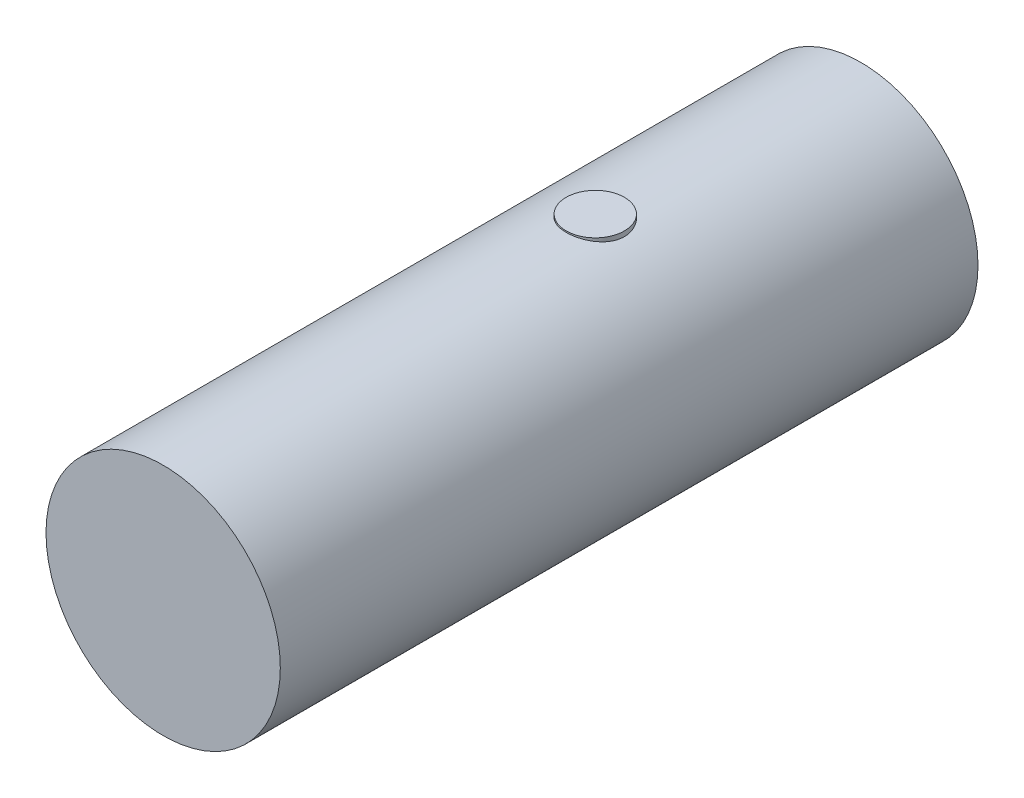
ISO-10303-21;
HEADER;
FILE_DESCRIPTION(('STEP AP214'),'2;1');
FILE_NAME('part.step','',(''),(''),'','','');
FILE_SCHEMA(('AUTOMOTIVE_DESIGN { 1 0 10303 214 1 1 1 1 }'));
ENDSEC;
DATA;
#1=APPLICATION_CONTEXT('core data for automotive mechanical design processes');
#2=APPLICATION_PROTOCOL_DEFINITION('international standard','automotive_design',2000,#1);
#3=PRODUCT_CONTEXT('',#1,'mechanical');
#4=PRODUCT('Part','Part','',(#3));
#5=PRODUCT_RELATED_PRODUCT_CATEGORY('part','',(#4));
#6=PRODUCT_DEFINITION_FORMATION('','',#4);
#7=PRODUCT_DEFINITION_CONTEXT('part definition',#1,'design');
#8=PRODUCT_DEFINITION('design','',#6,#7);
#9=PRODUCT_DEFINITION_SHAPE('','',#8);
#10=(LENGTH_UNIT() NAMED_UNIT(*) SI_UNIT(.MILLI.,.METRE.));
#11=(NAMED_UNIT(*) PLANE_ANGLE_UNIT() SI_UNIT($,.RADIAN.));
#12=(NAMED_UNIT(*) SI_UNIT($,.STERADIAN.) SOLID_ANGLE_UNIT());
#13=UNCERTAINTY_MEASURE_WITH_UNIT(LENGTH_MEASURE(1.E-05),#10,'distance_accuracy_value','');
#14=(GEOMETRIC_REPRESENTATION_CONTEXT(3) GLOBAL_UNCERTAINTY_ASSIGNED_CONTEXT((#13)) GLOBAL_UNIT_ASSIGNED_CONTEXT((#10,
#11,#12)) REPRESENTATION_CONTEXT('',''));
#15=CARTESIAN_POINT('',(0.,0.,0.));
#16=DIRECTION('',(0.,0.,1.));
#17=DIRECTION('',(1.,0.,0.));
#18=AXIS2_PLACEMENT_3D('',#15,#16,#17);
#19=CARTESIAN_POINT('',(0.,0.,530.));
#20=DIRECTION('',(0.,0.,-1.));
#21=DIRECTION('',(-1.,0.,0.));
#22=AXIS2_PLACEMENT_3D('',#19,#20,#21);
#23=CYLINDRICAL_SURFACE('',#22,89.);
#24=CARTESIAN_POINT('',(0.,-89.,223.836722891361));
#25=CARTESIAN_POINT('',(0.611417434861066,-88.9999985464395,223.836720283032));
#26=CARTESIAN_POINT('',(1.22288743460136,-88.9936837681099,223.811358850198));
#27=CARTESIAN_POINT('',(2.44141315504862,-88.9685956655376,223.71011842906));
#28=CARTESIAN_POINT('',(3.04846835638632,-88.9498208986903,223.634233591205));
#29=CARTESIAN_POINT('',(4.25405471726366,-88.9003215166107,223.432534381407));
#30=CARTESIAN_POINT('',(4.85258133373351,-88.869590762381,223.306694358479));
#31=CARTESIAN_POINT('',(6.03651638128261,-88.7970283616154,223.006130425489));
#32=CARTESIAN_POINT('',(6.62192515325348,-88.7551970039129,222.831407787328));
#33=CARTESIAN_POINT('',(7.77488875315294,-88.6616335104024,222.434716977997));
#34=CARTESIAN_POINT('',(8.34246429320108,-88.6099133950601,222.21280613098));
#35=CARTESIAN_POINT('',(9.45668604219611,-88.4979358023704,221.723315007667));
#36=CARTESIAN_POINT('',(10.0033321378508,-88.4376782788179,221.455734484203));
#37=CARTESIAN_POINT('',(11.0721153941217,-88.3102368754896,220.876868011026));
#38=CARTESIAN_POINT('',(11.5942525985915,-88.2430530081078,220.56558213952));
#39=CARTESIAN_POINT('',(12.6106869916732,-88.1035400960233,219.901485261214));
#40=CARTESIAN_POINT('',(13.1049838002433,-88.0312109811148,219.548673687761));
#41=CARTESIAN_POINT('',(14.0713941211849,-87.8819623826407,218.797075830624));
#42=CARTESIAN_POINT('',(14.5429360038649,-87.8049831108576,218.397566247634));
#43=CARTESIAN_POINT('',(15.4508605077163,-87.6497750771878,217.560634335578));
#44=CARTESIAN_POINT('',(15.887242717087,-87.5715463006795,217.123211562586));
#45=CARTESIAN_POINT('',(16.7220318332208,-87.4159824369374,216.213278706601));
#46=CARTESIAN_POINT('',(17.1204346733401,-87.3386474461831,215.740764875845));
#47=CARTESIAN_POINT('',(17.8765429426203,-87.1870284807439,214.763760089866));
#48=CARTESIAN_POINT('',(18.2342481446576,-87.1127445230876,214.259268956209));
#49=CARTESIAN_POINT('',(18.9114280506329,-86.9682675578958,213.213951779655));
#50=CARTESIAN_POINT('',(19.2302629561356,-86.8981508054627,212.6727004026));
#51=CARTESIAN_POINT('',(19.8210952025673,-86.765292169646,211.564326581557));
#52=CARTESIAN_POINT('',(20.0930919593524,-86.7025503782426,210.997203815024));
#53=CARTESIAN_POINT('',(20.5880813963424,-86.5863475188599,209.841115005616));
#54=CARTESIAN_POINT('',(20.8110800980383,-86.5328853106596,209.252151657192));
#55=CARTESIAN_POINT('',(21.2062736732786,-86.4368865631239,208.056553480614));
#56=CARTESIAN_POINT('',(21.3784697492819,-86.3943497651955,207.449919071094));
#57=CARTESIAN_POINT('',(21.6676830194959,-86.3222642012681,206.235627537426));
#58=CARTESIAN_POINT('',(21.7857262865732,-86.2924747055667,205.628229026273));
#59=CARTESIAN_POINT('',(21.9705710196255,-86.2455977482143,204.405197022614));
#60=CARTESIAN_POINT('',(22.0373731002468,-86.2285101342022,203.789563628976));
#61=CARTESIAN_POINT('',(22.1191425230928,-86.2075711481196,202.554725743573));
#62=CARTESIAN_POINT('',(22.1341171394841,-86.2037179185573,201.935521765172));
#63=CARTESIAN_POINT('',(22.112118039662,-86.2093635819393,200.698103245289));
#64=CARTESIAN_POINT('',(22.0751450364656,-86.2188622916189,200.079888690344));
#65=CARTESIAN_POINT('',(21.951090126737,-86.2505280996375,198.863848204196));
#66=CARTESIAN_POINT('',(21.8652314939444,-86.2723858463712,198.265888923805));
#67=CARTESIAN_POINT('',(21.6450619955579,-86.3278875035567,197.079528879885));
#68=CARTESIAN_POINT('',(21.5107520206519,-86.3615311973455,196.491127940853));
#69=CARTESIAN_POINT('',(21.1947565598354,-86.439624866144,195.327901939859));
#70=CARTESIAN_POINT('',(21.0130687840949,-86.4840753634533,194.753077535534));
#71=CARTESIAN_POINT('',(20.6037306640839,-86.5825072101249,193.620877674907));
#72=CARTESIAN_POINT('',(20.3760796033595,-86.6364887080501,193.063502490752));
#73=CARTESIAN_POINT('',(19.8740115526652,-86.7530443315757,191.964374445339));
#74=CARTESIAN_POINT('',(19.5991505862467,-86.8156988219588,191.422832963164));
#75=CARTESIAN_POINT('',(19.0062535263091,-86.9474237711596,190.364752811312));
#76=CARTESIAN_POINT('',(18.6882172745292,-87.0164942534951,189.848214233293));
#77=CARTESIAN_POINT('',(18.0111102695676,-87.1591623645108,188.843329039933));
#78=CARTESIAN_POINT('',(17.6520335786747,-87.2327606475579,188.354986519406));
#79=CARTESIAN_POINT('',(16.8952542730157,-87.3824875471304,187.409619199123));
#80=CARTESIAN_POINT('',(16.4975509270525,-87.4586162115376,186.952594992498));
#81=CARTESIAN_POINT('',(15.6543260663336,-87.6135316157466,186.060303524701));
#82=CARTESIAN_POINT('',(15.2077719941065,-87.6923327498429,185.626013917696));
#83=CARTESIAN_POINT('',(14.279480034281,-87.8482664510687,184.796477752047));
#84=CARTESIAN_POINT('',(13.7977414670952,-87.925398985932,184.401231947881));
#85=CARTESIAN_POINT('',(12.8022439233613,-88.0758532184272,183.652494192854));
#86=CARTESIAN_POINT('',(12.2884837174746,-88.1491747695537,183.299003846533));
#87=CARTESIAN_POINT('',(11.2323792533329,-88.2899620598654,182.636324277818));
#88=CARTESIAN_POINT('',(10.6900351682944,-88.3574278345298,182.327134787008));
#89=CARTESIAN_POINT('',(9.57854222481051,-88.4848317464139,181.754390630556));
#90=CARTESIAN_POINT('',(9.00930852040469,-88.5447435169379,181.490994654658));
#91=CARTESIAN_POINT('',(7.84973073396218,-88.6550668537858,181.013202636061));
#92=CARTESIAN_POINT('',(7.25938653512884,-88.7054783675386,180.79880686451));
#93=CARTESIAN_POINT('',(6.06193190185513,-88.7953455050925,180.420813661538));
#94=CARTESIAN_POINT('',(5.45482406300311,-88.8348028146389,180.257208413492));
#95=CARTESIAN_POINT('',(4.22825434503125,-88.9016256195665,179.982158018724));
#96=CARTESIAN_POINT('',(3.60879276728342,-88.9289914095467,179.870711601196));
#97=CARTESIAN_POINT('',(2.37800472643791,-88.9703017423091,179.703110232212));
#98=CARTESIAN_POINT('',(1.76686982341462,-88.9845687753807,179.645625888964));
#99=CARTESIAN_POINT('',(0.541776846993472,-89.0004591077316,179.581627766206));
#100=CARTESIAN_POINT('',(-0.0721811785695627,-89.0020826204579,179.575113126229));
#101=CARTESIAN_POINT('',(-1.29836494992999,-88.992640906152,179.61310796831));
#102=CARTESIAN_POINT('',(-1.9105908336067,-88.9815767192794,179.657613267665));
#103=CARTESIAN_POINT('',(-3.12888359218601,-88.9470710514266,179.797258775374));
#104=CARTESIAN_POINT('',(-3.73495049074011,-88.9236296179953,179.892398789208));
#105=CARTESIAN_POINT('',(-4.92772605698619,-88.8654535995452,180.130744836452));
#106=CARTESIAN_POINT('',(-5.51458827550597,-88.8308897038279,180.273225376903));
#107=CARTESIAN_POINT('',(-6.67404612553229,-88.7513087042272,180.605423039718));
#108=CARTESIAN_POINT('',(-7.24664193889438,-88.7062917336661,180.79513955962));
#109=CARTESIAN_POINT('',(-8.3737792862414,-88.6069972239677,181.220363795859));
#110=CARTESIAN_POINT('',(-8.92831949347095,-88.5527190061196,181.455874868429));
#111=CARTESIAN_POINT('',(-10.0156972910269,-88.4363321469712,181.970941355161));
#112=CARTESIAN_POINT('',(-10.548534484034,-88.3742233624012,182.250497575206));
#113=CARTESIAN_POINT('',(-11.5982735811343,-88.2426472316362,182.856968424446));
#114=CARTESIAN_POINT('',(-12.1147305304732,-88.1730696968033,183.184629362639));
#115=CARTESIAN_POINT('',(-13.1183406142375,-88.0293483360057,183.881220435908));
#116=CARTESIAN_POINT('',(-13.6054934663233,-87.9552044660591,184.250150968512));
#117=CARTESIAN_POINT('',(-14.5474687053753,-87.8043207984268,185.026858435296));
#118=CARTESIAN_POINT('',(-15.0022862726889,-87.7275806162599,185.434641139377));
#119=CARTESIAN_POINT('',(-15.8766236817422,-87.5735686099468,186.286351342642));
#120=CARTESIAN_POINT('',(-16.2961430184845,-87.4962967782116,186.730279358764));
#121=CARTESIAN_POINT('',(-17.1069145745709,-87.3414446953515,187.662642049423));
#122=CARTESIAN_POINT('',(-17.4972328041388,-87.2639025337404,188.151895806904));
#123=CARTESIAN_POINT('',(-18.2352921494787,-87.1126631522638,189.1621035297));
#124=CARTESIAN_POINT('',(-18.5830324971412,-87.0389660017764,189.683058066645));
#125=CARTESIAN_POINT('',(-19.2334170101124,-86.8975630732368,190.753162305219));
#126=CARTESIAN_POINT('',(-19.5360622439637,-86.829857153236,191.302311338356));
#127=CARTESIAN_POINT('',(-20.0939763917068,-86.702445423953,192.425064147003));
#128=CARTESIAN_POINT('',(-20.3492459597414,-86.6427395042133,192.998667584724));
#129=CARTESIAN_POINT('',(-20.8090024060997,-86.5334672706483,194.162810521756));
#130=CARTESIAN_POINT('',(-21.0137848412828,-86.4838422586432,194.753227729804));
#131=CARTESIAN_POINT('',(-21.3728572547733,-86.395805392065,195.950048896045));
#132=CARTESIAN_POINT('',(-21.5271473053565,-86.3573935214412,196.556452831353));
#133=CARTESIAN_POINT('',(-21.7838855369324,-86.2929885636361,197.780678173113));
#134=CARTESIAN_POINT('',(-21.8863431056197,-86.2669932276688,198.398497491031));
#135=CARTESIAN_POINT('',(-22.0385464293129,-86.2282359219173,199.641002725548));
#136=CARTESIAN_POINT('',(-22.0882934353954,-86.215473638049,200.265688478819));
#137=CARTESIAN_POINT('',(-22.1339720114701,-86.2037574264758,201.499353391954));
#138=CARTESIAN_POINT('',(-22.1313931147288,-86.204421301738,202.108274268385));
#139=CARTESIAN_POINT('',(-22.0760836605448,-86.2186020947281,203.323674392546));
#140=CARTESIAN_POINT('',(-22.0233541064955,-86.232118755303,203.930153688884));
#141=CARTESIAN_POINT('',(-21.8681966519184,-86.2715964859137,205.136288203086));
#142=CARTESIAN_POINT('',(-21.7657700514054,-86.2975572304271,205.735943599036));
#143=CARTESIAN_POINT('',(-21.5120753316172,-86.3611468624113,206.924197574176));
#144=CARTESIAN_POINT('',(-21.3608069680712,-86.3987758082378,207.512796098053));
#145=CARTESIAN_POINT('',(-21.0116807321801,-86.4843416084374,208.671449034642));
#146=CARTESIAN_POINT('',(-20.8141008443566,-86.5322168161991,209.241591849537));
#147=CARTESIAN_POINT('',(-20.3734006370197,-86.6370348473963,210.363119358729));
#148=CARTESIAN_POINT('',(-20.1302806380504,-86.6939776070076,210.914504185028));
#149=CARTESIAN_POINT('',(-19.6002524638716,-86.8153441582177,211.995014634405));
#150=CARTESIAN_POINT('',(-19.313339672779,-86.8797687382501,212.524137903545));
#151=CARTESIAN_POINT('',(-18.6977457359308,-87.014329453877,213.55673986192));
#152=CARTESIAN_POINT('',(-18.3690637092587,-87.08446570992,214.060218009983));
#153=CARTESIAN_POINT('',(-17.6631201643739,-87.2304269625012,215.051050723514));
#154=CARTESIAN_POINT('',(-17.2848233486681,-87.3063520908379,215.537653192133));
#155=CARTESIAN_POINT('',(-16.4891389705138,-87.4601191479664,216.47745244748));
#156=CARTESIAN_POINT('',(-16.0717507153964,-87.5379611107048,216.930648642021));
#157=CARTESIAN_POINT('',(-15.2005280167786,-87.6934418480589,217.800792898369));
#158=CARTESIAN_POINT('',(-14.7466852140695,-87.7710805718321,218.217732600473));
#159=CARTESIAN_POINT('',(-13.8055797403787,-87.9240194337534,219.012488489283));
#160=CARTESIAN_POINT('',(-13.3183171030074,-87.9993195742532,219.390304715335));
#161=CARTESIAN_POINT('',(-12.3045260831608,-88.1468412901257,220.110630802346));
#162=CARTESIAN_POINT('',(-11.7774513686129,-88.2189837382904,220.45238852));
#163=CARTESIAN_POINT('',(-10.6954788590971,-88.3566867459989,221.09020559653));
#164=CARTESIAN_POINT('',(-10.1405797508019,-88.4222469944199,221.38626279562));
#165=CARTESIAN_POINT('',(-9.00719553077263,-88.5448762288423,221.930206408655));
#166=CARTESIAN_POINT('',(-8.42872587950582,-88.6019506701904,222.178123802316));
#167=CARTESIAN_POINT('',(-7.25201807773631,-88.7060138125369,222.624003662575));
#168=CARTESIAN_POINT('',(-6.65378295108214,-88.7530040481123,222.821973730779));
#169=CARTESIAN_POINT('',(-5.5575506495898,-88.8276724042279,223.133475290624));
#170=CARTESIAN_POINT('',(-5.062195849085,-88.8573244973256,223.255909884693));
#171=CARTESIAN_POINT('',(-4.06366430078438,-88.9085852730814,223.466350137802));
#172=CARTESIAN_POINT('',(-3.56048567635054,-88.9301919939604,223.554347399929));
#173=CARTESIAN_POINT('',(-2.54898676628386,-88.9649297673758,223.695341445596));
#174=CARTESIAN_POINT('',(-2.04066678288252,-88.9780613152122,223.748340274495));
#175=CARTESIAN_POINT('',(-1.02157631844125,-88.9955959129651,223.819027532826));
#176=CARTESIAN_POINT('',(-0.510806503593696,-89.000001214372,223.83672507048));
#177=CARTESIAN_POINT('',(0.,-89.,223.836722891361));
#178=B_SPLINE_CURVE_WITH_KNOTS('',3,(#24,#25,#26,#27,#28,#29,#30,#31,#32,#33,#34,#35,#36,#37,
#38,#39,#40,#41,#42,#43,#44,#45,#46,#47,#48,#49,#50,#51,#52,#53,#54,#55,#56,#57,#58,#59,#60,#61,
#62,#63,#64,#65,#66,#67,#68,#69,#70,#71,#72,#73,#74,#75,#76,#77,#78,#79,#80,#81,#82,#83,#84,#85,
#86,#87,#88,#89,#90,#91,#92,#93,#94,#95,#96,#97,#98,#99,#100,#101,#102,#103,#104,#105,#106,#107,
#108,#109,#110,#111,#112,#113,#114,#115,#116,#117,#118,#119,#120,#121,#122,#123,#124,#125,#126,
#127,#128,#129,#130,#131,#132,#133,#134,#135,#136,#137,#138,#139,#140,#141,#142,#143,#144,#145,
#146,#147,#148,#149,#150,#151,#152,#153,#154,#155,#156,#157,#158,#159,#160,#161,#162,#163,#164,
#165,#166,#167,#168,#169,#170,#171,#172,#173,#174,#175,#176,#177),.UNSPECIFIED.,.T.,.F.,(4,2,2,
2,2,2,2,2,2,2,2,2,2,2,2,2,2,2,2,2,2,2,2,2,2,2,2,2,2,2,2,2,2,2,2,2,2,2,2,2,2,2,2,2,2,2,2,2,2,2,2,
2,2,2,2,2,2,2,2,2,2,2,2,2,2,2,2,2,2,2,2,2,2,2,2,2,4),(0.,1.83378687242754,3.66778609582947,
5.50272826161908,7.33762268759116,9.1703006926805,11.0029886167505,12.8356732614777,
14.6683829176345,16.5346375452217,18.4009140277756,20.2673901180967,22.1338766242558,
24.0278201457411,25.9217872859143,27.8155215414831,29.709210970232,31.5653646692888,
33.421496103134,35.2773670118478,37.1332124476991,38.9445403565847,40.7558349692707,
42.5672171403793,44.3786275486287,46.2081126842626,48.0376045261354,49.8673613938798,
51.6971529054175,53.5785701092764,55.4600236622676,57.3415494904427,59.223063918,
61.1109738040245,62.9988941367814,64.8865237757614,66.774107421821,68.613864735329,
70.4535909901243,72.2931664317517,74.132734806441,75.9453207108955,77.7578834982705,
79.570579176498,81.3833080250298,83.2279117377975,85.0725332201355,86.9174290738336,
88.7623513172186,90.6520815399997,92.5418458486913,94.4315653717172,96.3212588003674,
98.1996120715786,100.077962654065,101.955972915203,103.833938601076,105.658522224209,
107.483069342604,109.307568735615,111.132077253578,112.945902620997,114.759715221885,
116.573719135898,118.387761313747,120.248647700266,122.109567066434,123.97091437554,
125.832259812719,127.726889147686,129.621607994571,131.515103450224,133.408310556109,
134.940452879495,136.47296855533,138.005394660824,139.53742532798),.UNSPECIFIED.);
#179=CARTESIAN_POINT('',(0.,-89.,223.836722891361));
#180=VERTEX_POINT('',#179);
#181=EDGE_CURVE('E34',#180,#180,#178,.T.);
#182=ORIENTED_EDGE('',*,*,#181,.T.);
#183=EDGE_LOOP('',(#182));
#184=FACE_BOUND('',#183,.T.);
#185=CARTESIAN_POINT('',(0.,89.,223.836722891361));
#186=CARTESIAN_POINT('',(-0.611417434861066,88.9999985464394,223.836720283032));
#187=CARTESIAN_POINT('',(-1.22288743460136,88.9936837681099,223.811358850198));
#188=CARTESIAN_POINT('',(-2.44141315504862,88.9685956655376,223.71011842906));
#189=CARTESIAN_POINT('',(-3.04846835638632,88.9498208986903,223.634233591205));
#190=CARTESIAN_POINT('',(-4.25405471726366,88.9003215166107,223.432534381407));
#191=CARTESIAN_POINT('',(-4.85258133373351,88.869590762381,223.306694358479));
#192=CARTESIAN_POINT('',(-6.03651638128262,88.7970283616154,223.006130425489));
#193=CARTESIAN_POINT('',(-6.62192515325348,88.7551970039129,222.831407787328));
#194=CARTESIAN_POINT('',(-7.77488875315295,88.6616335104024,222.434716977997));
#195=CARTESIAN_POINT('',(-8.3424642932011,88.6099133950601,222.21280613098));
#196=CARTESIAN_POINT('',(-9.45668604219612,88.4979358023704,221.723315007667));
#197=CARTESIAN_POINT('',(-10.0033321378508,88.4376782788179,221.455734484203));
#198=CARTESIAN_POINT('',(-11.0721153941217,88.3102368754896,220.876868011026));
#199=CARTESIAN_POINT('',(-11.5942525985915,88.2430530081078,220.56558213952));
#200=CARTESIAN_POINT('',(-12.6106869916732,88.1035400960233,219.901485261214));
#201=CARTESIAN_POINT('',(-13.1049838002433,88.0312109811148,219.548673687761));
#202=CARTESIAN_POINT('',(-14.0713941211849,87.8819623826407,218.797075830624));
#203=CARTESIAN_POINT('',(-14.5429360038649,87.8049831108576,218.397566247634));
#204=CARTESIAN_POINT('',(-15.4508605077163,87.6497750771878,217.560634335578));
#205=CARTESIAN_POINT('',(-15.887242717087,87.5715463006795,217.123211562586));
#206=CARTESIAN_POINT('',(-16.7220318332208,87.4159824369374,216.213278706601));
#207=CARTESIAN_POINT('',(-17.1204346733401,87.3386474461831,215.740764875845));
#208=CARTESIAN_POINT('',(-17.8765429426203,87.1870284807439,214.763760089866));
#209=CARTESIAN_POINT('',(-18.2342481446576,87.1127445230876,214.259268956209));
#210=CARTESIAN_POINT('',(-18.9114280506329,86.9682675578958,213.213951779655));
#211=CARTESIAN_POINT('',(-19.2302629561356,86.8981508054627,212.6727004026));
#212=CARTESIAN_POINT('',(-19.8210952025673,86.765292169646,211.564326581557));
#213=CARTESIAN_POINT('',(-20.0930919593524,86.7025503782426,210.997203815024));
#214=CARTESIAN_POINT('',(-20.5880813963424,86.5863475188599,209.841115005616));
#215=CARTESIAN_POINT('',(-20.8110800980383,86.5328853106596,209.252151657192));
#216=CARTESIAN_POINT('',(-21.2062736732786,86.4368865631239,208.056553480614));
#217=CARTESIAN_POINT('',(-21.3784697492819,86.3943497651955,207.449919071094));
#218=CARTESIAN_POINT('',(-21.6676830194959,86.3222642012681,206.235627537426));
#219=CARTESIAN_POINT('',(-21.7857262865732,86.2924747055667,205.628229026273));
#220=CARTESIAN_POINT('',(-21.9705710196255,86.2455977482143,204.405197022614));
#221=CARTESIAN_POINT('',(-22.0373731002468,86.2285101342022,203.789563628976));
#222=CARTESIAN_POINT('',(-22.1191425230928,86.2075711481196,202.554725743573));
#223=CARTESIAN_POINT('',(-22.1341171394841,86.2037179185573,201.935521765172));
#224=CARTESIAN_POINT('',(-22.112118039662,86.2093635819393,200.698103245289));
#225=CARTESIAN_POINT('',(-22.0751450364656,86.2188622916189,200.079888690344));
#226=CARTESIAN_POINT('',(-21.951090126737,86.2505280996375,198.863848204196));
#227=CARTESIAN_POINT('',(-21.8652314939444,86.2723858463712,198.265888923805));
#228=CARTESIAN_POINT('',(-21.6450619955579,86.3278875035567,197.079528879885));
#229=CARTESIAN_POINT('',(-21.5107520206519,86.3615311973455,196.491127940853));
#230=CARTESIAN_POINT('',(-21.1947565598354,86.439624866144,195.327901939859));
#231=CARTESIAN_POINT('',(-21.0130687840949,86.4840753634533,194.753077535534));
#232=CARTESIAN_POINT('',(-20.6037306640839,86.5825072101249,193.620877674907));
#233=CARTESIAN_POINT('',(-20.3760796033595,86.6364887080501,193.063502490752));
#234=CARTESIAN_POINT('',(-19.8740115526652,86.7530443315757,191.964374445339));
#235=CARTESIAN_POINT('',(-19.5991505862467,86.8156988219588,191.422832963164));
#236=CARTESIAN_POINT('',(-19.0062535263091,86.9474237711596,190.364752811312));
#237=CARTESIAN_POINT('',(-18.6882172745292,87.0164942534951,189.848214233293));
#238=CARTESIAN_POINT('',(-18.0111102695676,87.1591623645108,188.843329039933));
#239=CARTESIAN_POINT('',(-17.6520335786747,87.2327606475579,188.354986519406));
#240=CARTESIAN_POINT('',(-16.8952542730157,87.3824875471304,187.409619199123));
#241=CARTESIAN_POINT('',(-16.4975509270525,87.4586162115376,186.952594992498));
#242=CARTESIAN_POINT('',(-15.6543260663336,87.6135316157466,186.060303524701));
#243=CARTESIAN_POINT('',(-15.2077719941065,87.6923327498429,185.626013917696));
#244=CARTESIAN_POINT('',(-14.279480034281,87.8482664510687,184.796477752047));
#245=CARTESIAN_POINT('',(-13.7977414670952,87.925398985932,184.401231947881));
#246=CARTESIAN_POINT('',(-12.8022439233613,88.0758532184272,183.652494192854));
#247=CARTESIAN_POINT('',(-12.2884837174746,88.1491747695537,183.299003846533));
#248=CARTESIAN_POINT('',(-11.2323792533329,88.2899620598654,182.636324277818));
#249=CARTESIAN_POINT('',(-10.6900351682944,88.3574278345298,182.327134787008));
#250=CARTESIAN_POINT('',(-9.57854222481051,88.4848317464139,181.754390630556));
#251=CARTESIAN_POINT('',(-9.00930852040469,88.5447435169379,181.490994654658));
#252=CARTESIAN_POINT('',(-7.84973073396218,88.6550668537858,181.013202636061));
#253=CARTESIAN_POINT('',(-7.25938653512884,88.7054783675386,180.79880686451));
#254=CARTESIAN_POINT('',(-6.06193190185514,88.7953455050925,180.420813661538));
#255=CARTESIAN_POINT('',(-5.45482406300311,88.8348028146389,180.257208413492));
#256=CARTESIAN_POINT('',(-4.22825434503125,88.9016256195665,179.982158018724));
#257=CARTESIAN_POINT('',(-3.60879276728343,88.9289914095467,179.870711601196));
#258=CARTESIAN_POINT('',(-2.37800472643791,88.9703017423091,179.703110232212));
#259=CARTESIAN_POINT('',(-1.76686982341461,88.9845687753807,179.645625888964));
#260=CARTESIAN_POINT('',(-0.541776846993458,89.0004591077316,179.581627766206));
#261=CARTESIAN_POINT('',(0.0721811785695748,89.0020826204579,179.575113126229));
#262=CARTESIAN_POINT('',(1.29836494993,88.992640906152,179.61310796831));
#263=CARTESIAN_POINT('',(1.91059083360671,88.9815767192794,179.657613267665));
#264=CARTESIAN_POINT('',(3.12888359218602,88.9470710514266,179.797258775374));
#265=CARTESIAN_POINT('',(3.73495049074012,88.9236296179953,179.892398789208));
#266=CARTESIAN_POINT('',(4.9277260569862,88.8654535995452,180.130744836453));
#267=CARTESIAN_POINT('',(5.51458827550599,88.8308897038279,180.273225376903));
#268=CARTESIAN_POINT('',(6.67404612553231,88.7513087042272,180.605423039718));
#269=CARTESIAN_POINT('',(7.24664193889439,88.7062917336661,180.79513955962));
#270=CARTESIAN_POINT('',(8.37377928624141,88.6069972239677,181.220363795859));
#271=CARTESIAN_POINT('',(8.92831949347096,88.5527190061196,181.455874868429));
#272=CARTESIAN_POINT('',(10.0156972910269,88.4363321469712,181.970941355161));
#273=CARTESIAN_POINT('',(10.548534484034,88.3742233624011,182.250497575206));
#274=CARTESIAN_POINT('',(11.5982735811343,88.2426472316362,182.856968424446));
#275=CARTESIAN_POINT('',(12.1147305304732,88.1730696968033,183.184629362639));
#276=CARTESIAN_POINT('',(13.1183406142375,88.0293483360057,183.881220435908));
#277=CARTESIAN_POINT('',(13.6054934663234,87.9552044660591,184.250150968512));
#278=CARTESIAN_POINT('',(14.5474687053753,87.8043207984268,185.026858435296));
#279=CARTESIAN_POINT('',(15.0022862726889,87.7275806162599,185.434641139377));
#280=CARTESIAN_POINT('',(15.8766236817422,87.5735686099468,186.286351342642));
#281=CARTESIAN_POINT('',(16.2961430184845,87.4962967782116,186.730279358764));
#282=CARTESIAN_POINT('',(17.1069145745709,87.3414446953515,187.662642049423));
#283=CARTESIAN_POINT('',(17.4972328041388,87.2639025337404,188.151895806904));
#284=CARTESIAN_POINT('',(18.2352921494787,87.1126631522638,189.1621035297));
#285=CARTESIAN_POINT('',(18.5830324971412,87.0389660017764,189.683058066645));
#286=CARTESIAN_POINT('',(19.2334170101124,86.8975630732368,190.753162305219));
#287=CARTESIAN_POINT('',(19.5360622439637,86.829857153236,191.302311338356));
#288=CARTESIAN_POINT('',(20.0939763917068,86.702445423953,192.425064147003));
#289=CARTESIAN_POINT('',(20.3492459597414,86.6427395042133,192.998667584724));
#290=CARTESIAN_POINT('',(20.8090024060997,86.5334672706483,194.162810521756));
#291=CARTESIAN_POINT('',(21.0137848412828,86.4838422586432,194.753227729804));
#292=CARTESIAN_POINT('',(21.3728572547733,86.395805392065,195.950048896045));
#293=CARTESIAN_POINT('',(21.5271473053565,86.3573935214412,196.556452831353));
#294=CARTESIAN_POINT('',(21.7838855369324,86.2929885636362,197.780678173113));
#295=CARTESIAN_POINT('',(21.8863431056196,86.2669932276688,198.398497491031));
#296=CARTESIAN_POINT('',(22.0385464293129,86.2282359219173,199.641002725548));
#297=CARTESIAN_POINT('',(22.0882934353954,86.215473638049,200.265688478819));
#298=CARTESIAN_POINT('',(22.1339720114702,86.2037574264758,201.499353391954));
#299=CARTESIAN_POINT('',(22.1313931147288,86.204421301738,202.108274268385));
#300=CARTESIAN_POINT('',(22.0760836605448,86.2186020947281,203.323674392546));
#301=CARTESIAN_POINT('',(22.0233541064955,86.232118755303,203.930153688884));
#302=CARTESIAN_POINT('',(21.8681966519184,86.2715964859137,205.136288203086));
#303=CARTESIAN_POINT('',(21.7657700514054,86.2975572304271,205.735943599036));
#304=CARTESIAN_POINT('',(21.5120753316171,86.3611468624113,206.924197574176));
#305=CARTESIAN_POINT('',(21.3608069680712,86.3987758082378,207.512796098053));
#306=CARTESIAN_POINT('',(21.01168073218,86.4843416084374,208.671449034642));
#307=CARTESIAN_POINT('',(20.8141008443566,86.5322168161991,209.241591849537));
#308=CARTESIAN_POINT('',(20.3734006370197,86.6370348473963,210.363119358729));
#309=CARTESIAN_POINT('',(20.1302806380504,86.6939776070076,210.914504185028));
#310=CARTESIAN_POINT('',(19.6002524638716,86.8153441582177,211.995014634405));
#311=CARTESIAN_POINT('',(19.313339672779,86.8797687382501,212.524137903546));
#312=CARTESIAN_POINT('',(18.6977457359308,87.014329453877,213.55673986192));
#313=CARTESIAN_POINT('',(18.3690637092587,87.08446570992,214.060218009983));
#314=CARTESIAN_POINT('',(17.6631201643739,87.2304269625012,215.051050723514));
#315=CARTESIAN_POINT('',(17.2848233486681,87.3063520908379,215.537653192133));
#316=CARTESIAN_POINT('',(16.4891389705137,87.4601191479664,216.47745244748));
#317=CARTESIAN_POINT('',(16.0717507153964,87.5379611107048,216.930648642021));
#318=CARTESIAN_POINT('',(15.2005280167786,87.6934418480589,217.800792898369));
#319=CARTESIAN_POINT('',(14.7466852140694,87.7710805718322,218.217732600473));
#320=CARTESIAN_POINT('',(13.8055797403787,87.9240194337534,219.012488489283));
#321=CARTESIAN_POINT('',(13.3183171030074,87.9993195742532,219.390304715335));
#322=CARTESIAN_POINT('',(12.3045260831607,88.1468412901257,220.110630802346));
#323=CARTESIAN_POINT('',(11.7774513686129,88.2189837382904,220.45238852));
#324=CARTESIAN_POINT('',(10.6954788590971,88.3566867459989,221.09020559653));
#325=CARTESIAN_POINT('',(10.1405797508018,88.4222469944199,221.38626279562));
#326=CARTESIAN_POINT('',(9.00719553077259,88.5448762288423,221.930206408655));
#327=CARTESIAN_POINT('',(8.42872587950578,88.6019506701904,222.178123802316));
#328=CARTESIAN_POINT('',(7.25201807773628,88.7060138125369,222.624003662575));
#329=CARTESIAN_POINT('',(6.65378295108212,88.7530040481123,222.821973730779));
#330=CARTESIAN_POINT('',(5.55755064958978,88.8276724042279,223.133475290624));
#331=CARTESIAN_POINT('',(5.06219584908497,88.8573244973256,223.255909884693));
#332=CARTESIAN_POINT('',(4.06366430078435,88.9085852730814,223.466350137802));
#333=CARTESIAN_POINT('',(3.56048567635053,88.9301919939604,223.554347399929));
#334=CARTESIAN_POINT('',(2.54898676628386,88.9649297673758,223.695341445596));
#335=CARTESIAN_POINT('',(2.04066678288252,88.9780613152122,223.748340274495));
#336=CARTESIAN_POINT('',(1.02157631844125,88.9955959129651,223.819027532826));
#337=CARTESIAN_POINT('',(0.510806503593695,89.0000012143719,223.83672507048));
#338=CARTESIAN_POINT('',(0.,89.,223.836722891361));
#339=B_SPLINE_CURVE_WITH_KNOTS('',3,(#185,#186,#187,#188,#189,#190,#191,#192,#193,#194,#195,
#196,#197,#198,#199,#200,#201,#202,#203,#204,#205,#206,#207,#208,#209,#210,#211,#212,#213,#214,
#215,#216,#217,#218,#219,#220,#221,#222,#223,#224,#225,#226,#227,#228,#229,#230,#231,#232,#233,
#234,#235,#236,#237,#238,#239,#240,#241,#242,#243,#244,#245,#246,#247,#248,#249,#250,#251,#252,
#253,#254,#255,#256,#257,#258,#259,#260,#261,#262,#263,#264,#265,#266,#267,#268,#269,#270,#271,
#272,#273,#274,#275,#276,#277,#278,#279,#280,#281,#282,#283,#284,#285,#286,#287,#288,#289,#290,
#291,#292,#293,#294,#295,#296,#297,#298,#299,#300,#301,#302,#303,#304,#305,#306,#307,#308,#309,
#310,#311,#312,#313,#314,#315,#316,#317,#318,#319,#320,#321,#322,#323,#324,#325,#326,#327,#328,
#329,#330,#331,#332,#333,#334,#335,#336,#337,#338),.UNSPECIFIED.,.T.,.F.,(4,2,2,2,2,2,2,2,2,2,2,
2,2,2,2,2,2,2,2,2,2,2,2,2,2,2,2,2,2,2,2,2,2,2,2,2,2,2,2,2,2,2,2,2,2,2,2,2,2,2,2,2,2,2,2,2,2,2,2,
2,2,2,2,2,2,2,2,2,2,2,2,2,2,2,2,2,4),(0.,1.83378687242754,3.66778609582948,5.50272826161908,
7.33762268759117,9.17030069268053,11.0029886167505,12.8356732614777,14.6683829176345,
16.5346375452217,18.4009140277756,20.2673901180967,22.1338766242558,24.0278201457411,
25.9217872859143,27.8155215414832,29.7092109702321,31.5653646692888,33.421496103134,
35.2773670118478,37.1332124476991,38.9445403565847,40.7558349692708,42.5672171403793,
44.3786275486287,46.2081126842626,48.0376045261354,49.8673613938798,51.6971529054176,
53.5785701092764,55.4600236622677,57.3415494904427,59.2230639180001,61.1109738040245,
62.9988941367814,64.8865237757614,66.774107421821,68.613864735329,70.4535909901243,
72.2931664317517,74.132734806441,75.9453207108955,77.7578834982705,79.570579176498,
81.3833080250299,83.2279117377975,85.0725332201355,86.9174290738336,88.7623513172186,
90.6520815399997,92.5418458486913,94.4315653717172,96.3212588003674,98.1996120715787,
100.077962654065,101.955972915203,103.833938601076,105.658522224209,107.483069342604,
109.307568735616,111.132077253578,112.945902620997,114.759715221885,116.573719135898,
118.387761313747,120.248647700266,122.109567066434,123.97091437554,125.832259812719,
127.726889147686,129.621607994571,131.515103450224,133.408310556109,134.940452879495,
136.47296855533,138.005394660824,139.53742532798),.UNSPECIFIED.);
#340=CARTESIAN_POINT('',(0.,89.,223.836722891361));
#341=VERTEX_POINT('',#340);
#342=EDGE_CURVE('E51',#341,#341,#339,.T.);
#343=ORIENTED_EDGE('',*,*,#342,.T.);
#344=EDGE_LOOP('',(#343));
#345=FACE_BOUND('',#344,.T.);
#346=CARTESIAN_POINT('',(0.,0.,530.));
#347=DIRECTION('',(0.,0.,1.));
#348=DIRECTION('',(1.,0.,0.));
#349=AXIS2_PLACEMENT_3D('',#346,#347,#348);
#350=CIRCLE('',#349,89.);
#351=CARTESIAN_POINT('',(89.,0.,530.));
#352=VERTEX_POINT('',#351);
#353=EDGE_CURVE('E10',#352,#352,#350,.T.);
#354=ORIENTED_EDGE('',*,*,#353,.F.);
#355=EDGE_LOOP('',(#354));
#356=FACE_BOUND('',#355,.T.);
#357=CARTESIAN_POINT('',(0.,0.,0.));
#358=DIRECTION('',(0.,0.,1.));
#359=DIRECTION('',(1.,0.,0.));
#360=AXIS2_PLACEMENT_3D('',#357,#358,#359);
#361=CIRCLE('',#360,89.);
#362=CARTESIAN_POINT('',(89.,0.,0.));
#363=VERTEX_POINT('',#362);
#364=EDGE_CURVE('E42',#363,#363,#361,.T.);
#365=ORIENTED_EDGE('',*,*,#364,.T.);
#366=EDGE_LOOP('',(#365));
#367=FACE_BOUND('',#366,.T.);
#368=ADVANCED_FACE('F30',(#184,#345,#356,#367),#23,.T.);
#369=CARTESIAN_POINT('',(0.,0.,530.));
#370=DIRECTION('',(0.,0.,1.));
#371=DIRECTION('',(1.,0.,0.));
#372=AXIS2_PLACEMENT_3D('',#369,#370,#371);
#373=PLANE('',#372);
#374=ORIENTED_EDGE('',*,*,#353,.T.);
#375=EDGE_LOOP('',(#374));
#376=FACE_BOUND('',#375,.T.);
#377=ADVANCED_FACE('F65',(#376),#373,.T.);
#378=CARTESIAN_POINT('',(0.,0.,0.));
#379=DIRECTION('',(0.,0.,1.));
#380=DIRECTION('',(1.,0.,0.));
#381=AXIS2_PLACEMENT_3D('',#378,#379,#380);
#382=PLANE('',#381);
#383=ORIENTED_EDGE('',*,*,#364,.F.);
#384=EDGE_LOOP('',(#383));
#385=FACE_BOUND('',#384,.T.);
#386=ADVANCED_FACE('F68',(#385),#382,.F.);
#387=CARTESIAN_POINT('',(0.,90.,201.710109627946));
#388=DIRECTION('',(0.,1.,0.));
#389=DIRECTION('',(0.,0.,1.));
#390=AXIS2_PLACEMENT_3D('',#387,#388,#389);
#391=PLANE('',#390);
#392=CARTESIAN_POINT('',(0.,90.,201.710109627946));
#393=DIRECTION('',(0.,1.,0.));
#394=DIRECTION('',(0.,0.,1.));
#395=AXIS2_PLACEMENT_3D('',#392,#393,#394);
#396=CIRCLE('',#395,22.1266132634148);
#397=CARTESIAN_POINT('',(0.,90.,223.836722891361));
#398=VERTEX_POINT('',#397);
#399=EDGE_CURVE('E94',#398,#398,#396,.T.);
#400=ORIENTED_EDGE('',*,*,#399,.T.);
#401=EDGE_LOOP('',(#400));
#402=FACE_BOUND('',#401,.T.);
#403=ADVANCED_FACE('F70',(#402),#391,.T.);
#404=CARTESIAN_POINT('',(0.,-90.,201.710109627946));
#405=DIRECTION('',(0.,1.,0.));
#406=DIRECTION('',(0.,0.,1.));
#407=AXIS2_PLACEMENT_3D('',#404,#405,#406);
#408=CYLINDRICAL_SURFACE('',#407,22.1266132634148);
#409=ORIENTED_EDGE('',*,*,#399,.F.);
#410=EDGE_LOOP('',(#409));
#411=FACE_BOUND('',#410,.T.);
#412=ORIENTED_EDGE('',*,*,#342,.F.);
#413=EDGE_LOOP('',(#412));
#414=FACE_BOUND('',#413,.T.);
#415=ADVANCED_FACE('F62',(#411,#414),#408,.T.);
#416=CARTESIAN_POINT('',(0.,-90.,201.710109627946));
#417=DIRECTION('',(0.,1.,0.));
#418=DIRECTION('',(0.,0.,1.));
#419=AXIS2_PLACEMENT_3D('',#416,#417,#418);
#420=CIRCLE('',#419,22.1266132634148);
#421=CARTESIAN_POINT('',(0.,-90.,223.836722891361));
#422=VERTEX_POINT('',#421);
#423=EDGE_CURVE('E49',#422,#422,#420,.T.);
#424=ORIENTED_EDGE('',*,*,#423,.T.);
#425=EDGE_LOOP('',(#424));
#426=FACE_BOUND('',#425,.T.);
#427=ORIENTED_EDGE('',*,*,#181,.F.);
#428=EDGE_LOOP('',(#427));
#429=FACE_BOUND('',#428,.T.);
#430=ADVANCED_FACE('F56',(#426,#429),#408,.T.);
#431=CARTESIAN_POINT('',(0.,-90.,201.710109627946));
#432=DIRECTION('',(0.,1.,0.));
#433=DIRECTION('',(0.,0.,1.));
#434=AXIS2_PLACEMENT_3D('',#431,#432,#433);
#435=PLANE('',#434);
#436=ORIENTED_EDGE('',*,*,#423,.F.);
#437=EDGE_LOOP('',(#436));
#438=FACE_BOUND('',#437,.T.);
#439=ADVANCED_FACE('F61',(#438),#435,.F.);
#440=CLOSED_SHELL('',(#368,#377,#386,#403,#415,#430,#439));
#441=MANIFOLD_SOLID_BREP('B2',#440);
#442=ADVANCED_BREP_SHAPE_REPRESENTATION('',(#18,#441),#14);
#443=SHAPE_DEFINITION_REPRESENTATION(#9,#442);
ENDSEC;
END-ISO-10303-21;
